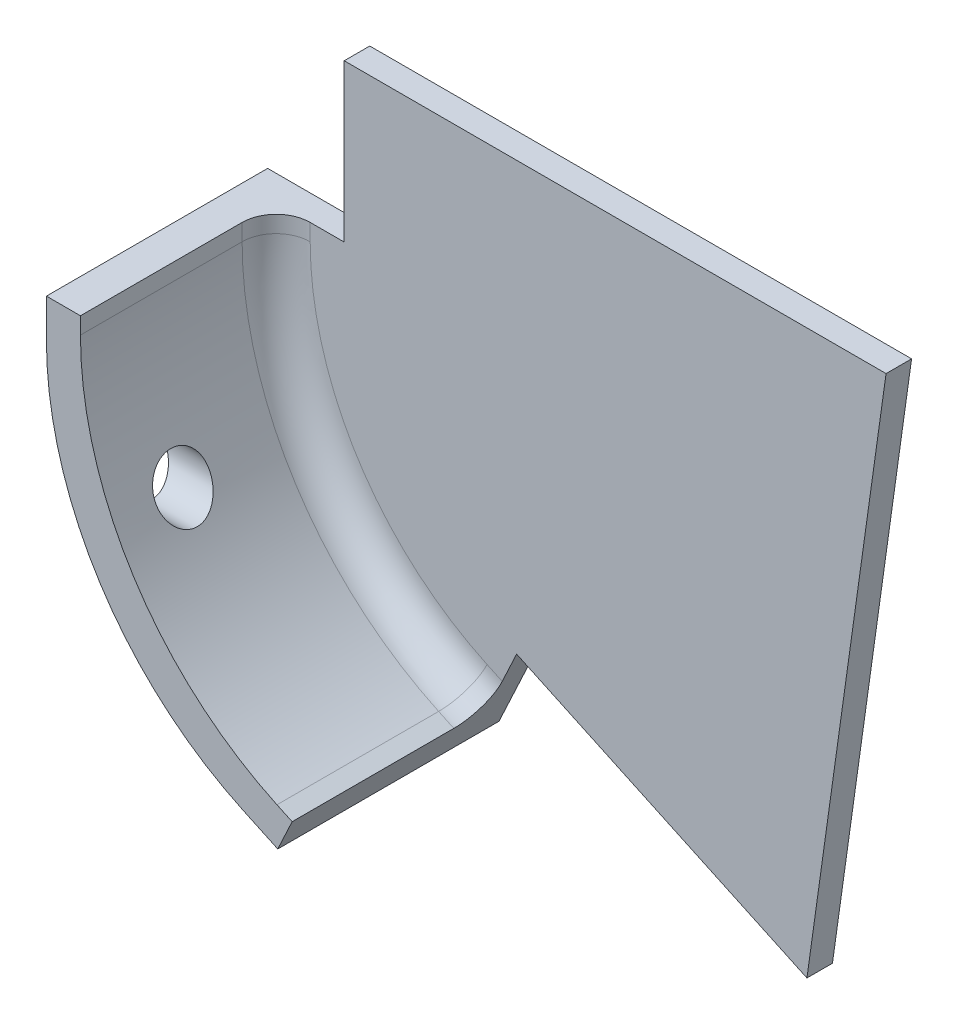
ISO-10303-21;
HEADER;
FILE_DESCRIPTION(('STEP AP214'),'2;1');
FILE_NAME('part.step','',(''),(''),'','','');
FILE_SCHEMA(('AUTOMOTIVE_DESIGN { 1 0 10303 214 1 1 1 1 }'));
ENDSEC;
DATA;
#1=APPLICATION_CONTEXT('core data for automotive mechanical design processes');
#2=APPLICATION_PROTOCOL_DEFINITION('international standard','automotive_design',2000,#1);
#3=PRODUCT_CONTEXT('',#1,'mechanical');
#4=PRODUCT('Part','Part','',(#3));
#5=PRODUCT_RELATED_PRODUCT_CATEGORY('part','',(#4));
#6=PRODUCT_DEFINITION_FORMATION('','',#4);
#7=PRODUCT_DEFINITION_CONTEXT('part definition',#1,'design');
#8=PRODUCT_DEFINITION('design','',#6,#7);
#9=PRODUCT_DEFINITION_SHAPE('','',#8);
#10=(LENGTH_UNIT() NAMED_UNIT(*) SI_UNIT(.MILLI.,.METRE.));
#11=(NAMED_UNIT(*) PLANE_ANGLE_UNIT() SI_UNIT($,.RADIAN.));
#12=(NAMED_UNIT(*) SI_UNIT($,.STERADIAN.) SOLID_ANGLE_UNIT());
#13=UNCERTAINTY_MEASURE_WITH_UNIT(LENGTH_MEASURE(1.E-05),#10,'distance_accuracy_value','');
#14=(GEOMETRIC_REPRESENTATION_CONTEXT(3) GLOBAL_UNCERTAINTY_ASSIGNED_CONTEXT((#13)) GLOBAL_UNIT_ASSIGNED_CONTEXT((#10,
#11,#12)) REPRESENTATION_CONTEXT('',''));
#15=CARTESIAN_POINT('',(0.,0.,0.));
#16=DIRECTION('',(0.,0.,1.));
#17=DIRECTION('',(1.,0.,0.));
#18=AXIS2_PLACEMENT_3D('',#15,#16,#17);
#19=CARTESIAN_POINT('',(-18.0763999587272,-9.66698227820091,1.5));
#20=DIRECTION('',(1.,0.,0.));
#21=DIRECTION('',(0.,1.,0.));
#22=AXIS2_PLACEMENT_3D('',#19,#20,#21);
#23=PLANE('',#22);
#24=DIRECTION('',(0.,-1.,0.));
#25=VECTOR('',#24,1.);
#26=CARTESIAN_POINT('',(-18.0763999587272,-9.66698227820091,0.));
#27=LINE('',#26,#25);
#28=CARTESIAN_POINT('',(-18.0763999587272,-4.26205433738103,0.));
#29=VERTEX_POINT('',#28);
#30=CARTESIAN_POINT('',(-18.0763999587272,-13.4894038430459,0.));
#31=VERTEX_POINT('',#30);
#32=EDGE_CURVE('E222',#29,#31,#27,.T.);
#33=ORIENTED_EDGE('',*,*,#32,.T.);
#34=DIRECTION('',(0.,0.,1.));
#35=VECTOR('',#34,1.);
#36=CARTESIAN_POINT('',(-18.0763999587272,-13.4894038430459,1.5));
#37=LINE('',#36,#35);
#38=CARTESIAN_POINT('',(-18.0763999587272,-13.4894038430459,1.5));
#39=VERTEX_POINT('',#38);
#40=EDGE_CURVE('E213',#31,#39,#37,.T.);
#41=ORIENTED_EDGE('',*,*,#40,.T.);
#42=DIRECTION('',(0.,-1.,0.));
#43=VECTOR('',#42,1.);
#44=CARTESIAN_POINT('',(-18.0763999587272,-4.26205433738103,1.5));
#45=LINE('',#44,#43);
#46=CARTESIAN_POINT('',(-18.0763999587272,-4.26205433738103,1.5));
#47=VERTEX_POINT('',#46);
#48=EDGE_CURVE('E223',#47,#39,#45,.T.);
#49=ORIENTED_EDGE('',*,*,#48,.F.);
#50=DIRECTION('',(0.,0.,-1.));
#51=VECTOR('',#50,1.);
#52=CARTESIAN_POINT('',(-18.0763999587272,-4.26205433738103,1.5));
#53=LINE('',#52,#51);
#54=EDGE_CURVE('E237',#47,#29,#53,.T.);
#55=ORIENTED_EDGE('',*,*,#54,.T.);
#56=EDGE_LOOP('',(#33,#41,#49,#55));
#57=FACE_BOUND('',#56,.T.);
#58=ADVANCED_FACE('F45',(#57),#23,.F.);
#59=CARTESIAN_POINT('',(-4.48178315317741,-31.0062562043114,1.5));
#60=DIRECTION('',(0.422618261740697,0.906307787036651,0.));
#61=DIRECTION('',(-0.906307787036651,0.422618261740697,0.));
#62=AXIS2_PLACEMENT_3D('',#59,#60,#61);
#63=PLANE('',#62);
#64=DIRECTION('',(0.906307787036651,-0.422618261740697,0.));
#65=VECTOR('',#64,1.);
#66=CARTESIAN_POINT('',(-4.48178315317741,-31.0062562043114,1.5));
#67=LINE('',#66,#65);
#68=CARTESIAN_POINT('',(-7.94607358273322,-29.3908310469364,1.5));
#69=VERTEX_POINT('',#68);
#70=CARTESIAN_POINT('',(9.11283365237236,-37.3455301304218,1.5));
#71=VERTEX_POINT('',#70);
#72=EDGE_CURVE('E227',#69,#71,#67,.T.);
#73=ORIENTED_EDGE('',*,*,#72,.F.);
#74=DIRECTION('',(0.,0.,-1.));
#75=VECTOR('',#74,1.);
#76=CARTESIAN_POINT('',(-7.94607358273322,-29.3908310469364,1.5));
#77=LINE('',#76,#75);
#78=CARTESIAN_POINT('',(-7.94607358273322,-29.3908310469364,0.));
#79=VERTEX_POINT('',#78);
#80=EDGE_CURVE('E219',#69,#79,#77,.T.);
#81=ORIENTED_EDGE('',*,*,#80,.T.);
#82=DIRECTION('',(0.906307787036651,-0.422618261740697,0.));
#83=VECTOR('',#82,1.);
#84=CARTESIAN_POINT('',(-4.48178315317741,-31.0062562043114,0.));
#85=LINE('',#84,#83);
#86=CARTESIAN_POINT('',(9.11283365237236,-37.3455301304218,0.));
#87=VERTEX_POINT('',#86);
#88=EDGE_CURVE('E240',#79,#87,#85,.T.);
#89=ORIENTED_EDGE('',*,*,#88,.T.);
#90=DIRECTION('',(0.,0.,-1.));
#91=VECTOR('',#90,1.);
#92=CARTESIAN_POINT('',(9.11283365237236,-37.3455301304218,1.5));
#93=LINE('',#92,#91);
#94=EDGE_CURVE('E256',#71,#87,#93,.T.);
#95=ORIENTED_EDGE('',*,*,#94,.F.);
#96=EDGE_LOOP('',(#73,#81,#89,#95));
#97=FACE_BOUND('',#96,.T.);
#98=ADVANCED_FACE('F377',(#97),#63,.F.);
#99=CARTESIAN_POINT('',(9.11283365237236,-37.3455301304218,1.5));
#100=DIRECTION('',(-0.990268068741571,0.139173100960062,0.));
#101=DIRECTION('',(-0.139173100960062,-0.990268068741571,0.));
#102=AXIS2_PLACEMENT_3D('',#99,#100,#101);
#103=PLANE('',#102);
#104=DIRECTION('',(0.139173100960062,0.990268068741571,0.));
#105=VECTOR('',#104,1.);
#106=CARTESIAN_POINT('',(9.11283365237236,-37.3455301304218,0.));
#107=LINE('',#106,#105);
#108=CARTESIAN_POINT('',(13.7624129551826,-4.26205433738103,0.));
#109=VERTEX_POINT('',#108);
#110=EDGE_CURVE('E243',#87,#109,#107,.T.);
#111=ORIENTED_EDGE('',*,*,#110,.T.);
#112=DIRECTION('',(0.,0.,-1.));
#113=VECTOR('',#112,1.);
#114=CARTESIAN_POINT('',(13.7624129551826,-4.26205433738103,1.5));
#115=LINE('',#114,#113);
#116=CARTESIAN_POINT('',(13.7624129551826,-4.26205433738103,1.5));
#117=VERTEX_POINT('',#116);
#118=EDGE_CURVE('E252',#117,#109,#115,.T.);
#119=ORIENTED_EDGE('',*,*,#118,.F.);
#120=DIRECTION('',(0.139173100960062,0.990268068741571,0.));
#121=VECTOR('',#120,1.);
#122=CARTESIAN_POINT('',(9.11283365237236,-37.3455301304218,1.5));
#123=LINE('',#122,#121);
#124=EDGE_CURVE('E231',#71,#117,#123,.T.);
#125=ORIENTED_EDGE('',*,*,#124,.F.);
#126=ORIENTED_EDGE('',*,*,#94,.T.);
#127=EDGE_LOOP('',(#111,#119,#125,#126));
#128=FACE_BOUND('',#127,.T.);
#129=ADVANCED_FACE('F373',(#128),#103,.F.);
#130=CARTESIAN_POINT('',(-18.0763999587272,-4.26205433738103,1.5));
#131=DIRECTION('',(0.,-1.,0.));
#132=DIRECTION('',(0.,0.,-1.));
#133=AXIS2_PLACEMENT_3D('',#130,#131,#132);
#134=PLANE('',#133);
#135=DIRECTION('',(-1.,0.,0.));
#136=VECTOR('',#135,1.);
#137=CARTESIAN_POINT('',(-18.0763999587272,-4.26205433738103,0.));
#138=LINE('',#137,#136);
#139=EDGE_CURVE('E228',#109,#29,#138,.T.);
#140=ORIENTED_EDGE('',*,*,#139,.T.);
#141=ORIENTED_EDGE('',*,*,#54,.F.);
#142=DIRECTION('',(-1.,0.,0.));
#143=VECTOR('',#142,1.);
#144=CARTESIAN_POINT('',(-18.0763999587272,-4.26205433738103,1.5));
#145=LINE('',#144,#143);
#146=EDGE_CURVE('E234',#117,#47,#145,.T.);
#147=ORIENTED_EDGE('',*,*,#146,.F.);
#148=ORIENTED_EDGE('',*,*,#118,.T.);
#149=EDGE_LOOP('',(#140,#141,#147,#148));
#150=FACE_BOUND('',#149,.T.);
#151=ADVANCED_FACE('F366',(#150),#134,.F.);
#152=CARTESIAN_POINT('',(0.,0.,1.5));
#153=DIRECTION('',(0.,0.,1.));
#154=DIRECTION('',(1.,0.,0.));
#155=AXIS2_PLACEMENT_3D('',#152,#153,#154);
#156=PLANE('',#155);
#157=DIRECTION('',(-1.,0.,0.));
#158=VECTOR('',#157,1.);
#159=CARTESIAN_POINT('',(-17.0763999587272,-13.4894038430459,1.5));
#160=LINE('',#159,#158);
#161=CARTESIAN_POINT('',(-20.0763999587272,-13.4894038430459,1.5));
#162=VERTEX_POINT('',#161);
#163=EDGE_CURVE('E174',#39,#162,#160,.T.);
#164=ORIENTED_EDGE('',*,*,#163,.T.);
#165=DIRECTION('',(0.,-1.,0.));
#166=VECTOR('',#165,1.);
#167=CARTESIAN_POINT('',(-20.0763999587272,0.,1.5));
#168=LINE('',#167,#166);
#169=CARTESIAN_POINT('',(-20.0763999587272,-14.473858105281,1.5));
#170=VERTEX_POINT('',#169);
#171=EDGE_CURVE('E288',#162,#170,#168,.T.);
#172=ORIENTED_EDGE('',*,*,#171,.T.);
#173=CARTESIAN_POINT('',(-2.07639995872717,-14.473858105281,1.5));
#174=DIRECTION('',(0.,0.,1.));
#175=DIRECTION('',(1.,0.,0.));
#176=AXIS2_PLACEMENT_3D('',#173,#174,#175);
#177=CIRCLE('',#176,18.);
#178=CARTESIAN_POINT('',(-9.68352867005972,-30.7873982719407,1.5));
#179=VERTEX_POINT('',#178);
#180=EDGE_CURVE('E282',#170,#179,#177,.T.);
#181=ORIENTED_EDGE('',*,*,#180,.T.);
#182=DIRECTION('',(0.906307787036651,-0.422618261740697,0.));
#183=VECTOR('',#182,1.);
#184=CARTESIAN_POINT('',(-13.5217958936059,-28.9975848715558,1.5));
#185=LINE('',#184,#183);
#186=CARTESIAN_POINT('',(-8.79131010621462,-31.2034466210097,1.5));
#187=VERTEX_POINT('',#186);
#188=EDGE_CURVE('E285',#179,#187,#185,.T.);
#189=ORIENTED_EDGE('',*,*,#188,.T.);
#190=DIRECTION('',(0.422618261740697,0.906307787036651,0.));
#191=VECTOR('',#190,1.);
#192=CARTESIAN_POINT('',(-9.63654662969602,-33.016062195083,1.5));
#193=LINE('',#192,#191);
#194=EDGE_CURVE('E319',#187,#69,#193,.T.);
#195=ORIENTED_EDGE('',*,*,#194,.T.);
#196=ORIENTED_EDGE('',*,*,#72,.T.);
#197=ORIENTED_EDGE('',*,*,#124,.T.);
#198=ORIENTED_EDGE('',*,*,#146,.T.);
#199=ORIENTED_EDGE('',*,*,#48,.T.);
#200=EDGE_LOOP('',(#164,#172,#181,#189,#195,#196,#197,#198,#199));
#201=FACE_BOUND('',#200,.T.);
#202=ADVANCED_FACE('F363',(#201),#156,.T.);
#203=CARTESIAN_POINT('',(0.,0.,0.));
#204=DIRECTION('',(0.,0.,1.));
#205=DIRECTION('',(1.,0.,0.));
#206=AXIS2_PLACEMENT_3D('',#203,#204,#205);
#207=PLANE('',#206);
#208=DIRECTION('',(-0.906307787036651,0.422618261740697,0.));
#209=VECTOR('',#208,1.);
#210=CARTESIAN_POINT('',(-10.4817831531774,-34.8286777691563,0.));
#211=LINE('',#210,#209);
#212=CARTESIAN_POINT('',(-10.4817831531774,-34.8286777691563,0.));
#213=VERTEX_POINT('',#212);
#214=CARTESIAN_POINT('',(-12.5287651935411,-33.874154367629,0.));
#215=VERTEX_POINT('',#214);
#216=EDGE_CURVE('E203',#213,#215,#211,.T.);
#217=ORIENTED_EDGE('',*,*,#216,.T.);
#218=CARTESIAN_POINT('',(-4.07639995872718,-15.747998626896,0.));
#219=DIRECTION('',(0.,0.,1.));
#220=DIRECTION('',(1.,0.,0.));
#221=AXIS2_PLACEMENT_3D('',#218,#219,#220);
#222=CIRCLE('',#221,20.);
#223=CARTESIAN_POINT('',(-24.0763999587272,-15.747998626896,0.));
#224=VERTEX_POINT('',#223);
#225=EDGE_CURVE('E270',#215,#224,#222,.F.);
#226=ORIENTED_EDGE('',*,*,#225,.T.);
#227=DIRECTION('',(0.,1.,0.));
#228=VECTOR('',#227,1.);
#229=CARTESIAN_POINT('',(-24.0763999587272,-28.4894038430459,0.));
#230=LINE('',#229,#228);
#231=CARTESIAN_POINT('',(-24.0763999587272,-13.4894038430459,0.));
#232=VERTEX_POINT('',#231);
#233=EDGE_CURVE('E190',#224,#232,#230,.T.);
#234=ORIENTED_EDGE('',*,*,#233,.T.);
#235=DIRECTION('',(1.,0.,0.));
#236=VECTOR('',#235,1.);
#237=CARTESIAN_POINT('',(-24.0763999587272,-13.4894038430459,0.));
#238=LINE('',#237,#236);
#239=EDGE_CURVE('E183',#232,#31,#238,.T.);
#240=ORIENTED_EDGE('',*,*,#239,.T.);
#241=ORIENTED_EDGE('',*,*,#32,.F.);
#242=ORIENTED_EDGE('',*,*,#139,.F.);
#243=ORIENTED_EDGE('',*,*,#110,.F.);
#244=ORIENTED_EDGE('',*,*,#88,.F.);
#245=DIRECTION('',(-0.422618261740697,-0.906307787036651,0.));
#246=VECTOR('',#245,1.);
#247=CARTESIAN_POINT('',(-10.4817831531774,-34.8286777691563,0.));
#248=LINE('',#247,#246);
#249=EDGE_CURVE('E164',#79,#213,#248,.T.);
#250=ORIENTED_EDGE('',*,*,#249,.T.);
#251=EDGE_LOOP('',(#217,#226,#234,#240,#241,#242,#243,#244,#250));
#252=FACE_BOUND('',#251,.T.);
#253=ADVANCED_FACE('F362',(#252),#207,.F.);
#254=CARTESIAN_POINT('',(-10.4817831531774,-34.8286777691563,13.));
#255=DIRECTION('',(0.906307787036651,-0.422618261740697,0.));
#256=DIRECTION('',(0.422618261740697,0.906307787036651,0.));
#257=AXIS2_PLACEMENT_3D('',#254,#255,#256);
#258=PLANE('',#257);
#259=ORIENTED_EDGE('',*,*,#194,.F.);
#260=CARTESIAN_POINT('',(-8.79131010621462,-31.2034466210097,3.5));
#261=DIRECTION('',(0.906307787036651,-0.422618261740697,0.));
#262=DIRECTION('',(0.422618261740697,0.906307787036651,0.));
#263=AXIS2_PLACEMENT_3D('',#260,#261,#262);
#264=CIRCLE('',#263,2.);
#265=CARTESIAN_POINT('',(-9.63654662969602,-33.016062195083,3.5));
#266=VERTEX_POINT('',#265);
#267=EDGE_CURVE('E11',#187,#266,#264,.F.);
#268=ORIENTED_EDGE('',*,*,#267,.T.);
#269=DIRECTION('',(0.,0.,1.));
#270=VECTOR('',#269,1.);
#271=CARTESIAN_POINT('',(-9.63654662969602,-33.016062195083,1.5));
#272=LINE('',#271,#270);
#273=CARTESIAN_POINT('',(-9.63654662969602,-33.016062195083,13.));
#274=VERTEX_POINT('',#273);
#275=EDGE_CURVE('E156',#266,#274,#272,.T.);
#276=ORIENTED_EDGE('',*,*,#275,.T.);
#277=DIRECTION('',(-0.422618261740697,-0.906307787036651,0.));
#278=VECTOR('',#277,1.);
#279=CARTESIAN_POINT('',(-10.4817831531774,-34.8286777691563,13.));
#280=LINE('',#279,#278);
#281=CARTESIAN_POINT('',(-10.4817831531774,-34.8286777691563,13.));
#282=VERTEX_POINT('',#281);
#283=EDGE_CURVE('E161',#274,#282,#280,.T.);
#284=ORIENTED_EDGE('',*,*,#283,.T.);
#285=DIRECTION('',(0.,0.,-1.));
#286=VECTOR('',#285,1.);
#287=CARTESIAN_POINT('',(-10.4817831531774,-34.8286777691563,13.));
#288=LINE('',#287,#286);
#289=EDGE_CURVE('E200',#282,#213,#288,.T.);
#290=ORIENTED_EDGE('',*,*,#289,.T.);
#291=ORIENTED_EDGE('',*,*,#249,.F.);
#292=ORIENTED_EDGE('',*,*,#80,.F.);
#293=EDGE_LOOP('',(#259,#268,#276,#284,#290,#291,#292));
#294=FACE_BOUND('',#293,.T.);
#295=ADVANCED_FACE('F158',(#294),#258,.T.);
#296=CARTESIAN_POINT('',(-24.0763999587272,-13.4894038430459,13.));
#297=DIRECTION('',(0.,1.,0.));
#298=DIRECTION('',(0.,0.,1.));
#299=AXIS2_PLACEMENT_3D('',#296,#297,#298);
#300=PLANE('',#299);
#301=DIRECTION('',(0.,0.,1.));
#302=VECTOR('',#301,1.);
#303=CARTESIAN_POINT('',(-22.0763999587272,-13.4894038430459,1.5));
#304=LINE('',#303,#302);
#305=CARTESIAN_POINT('',(-22.0763999587272,-13.4894038430459,3.5));
#306=VERTEX_POINT('',#305);
#307=CARTESIAN_POINT('',(-22.0763999587272,-13.4894038430459,13.));
#308=VERTEX_POINT('',#307);
#309=EDGE_CURVE('E165',#306,#308,#304,.T.);
#310=ORIENTED_EDGE('',*,*,#309,.F.);
#311=CARTESIAN_POINT('',(-20.0763999587272,-13.4894038430459,3.5));
#312=DIRECTION('',(0.,1.,0.));
#313=DIRECTION('',(0.,0.,1.));
#314=AXIS2_PLACEMENT_3D('',#311,#312,#313);
#315=CIRCLE('',#314,2.);
#316=EDGE_CURVE('E60',#306,#162,#315,.F.);
#317=ORIENTED_EDGE('',*,*,#316,.T.);
#318=ORIENTED_EDGE('',*,*,#163,.F.);
#319=ORIENTED_EDGE('',*,*,#40,.F.);
#320=ORIENTED_EDGE('',*,*,#239,.F.);
#321=DIRECTION('',(0.,0.,-1.));
#322=VECTOR('',#321,1.);
#323=CARTESIAN_POINT('',(-24.0763999587272,-13.4894038430459,13.));
#324=LINE('',#323,#322);
#325=CARTESIAN_POINT('',(-24.0763999587272,-13.4894038430459,13.));
#326=VERTEX_POINT('',#325);
#327=EDGE_CURVE('E209',#326,#232,#324,.T.);
#328=ORIENTED_EDGE('',*,*,#327,.F.);
#329=DIRECTION('',(1.,0.,0.));
#330=VECTOR('',#329,1.);
#331=CARTESIAN_POINT('',(-24.0763999587272,-13.4894038430459,13.));
#332=LINE('',#331,#330);
#333=EDGE_CURVE('E196',#326,#308,#332,.T.);
#334=ORIENTED_EDGE('',*,*,#333,.T.);
#335=EDGE_LOOP('',(#310,#317,#318,#319,#320,#328,#334));
#336=FACE_BOUND('',#335,.T.);
#337=ADVANCED_FACE('F349',(#336),#300,.T.);
#338=CARTESIAN_POINT('',(-24.0763999587272,-28.4894038430459,13.));
#339=DIRECTION('',(-1.,0.,0.));
#340=DIRECTION('',(0.,0.,1.));
#341=AXIS2_PLACEMENT_3D('',#338,#339,#340);
#342=PLANE('',#341);
#343=ORIENTED_EDGE('',*,*,#233,.F.);
#344=DIRECTION('',(0.,0.,-1.));
#345=VECTOR('',#344,1.);
#346=CARTESIAN_POINT('',(-24.0763999587272,-15.747998626896,13.));
#347=LINE('',#346,#345);
#348=CARTESIAN_POINT('',(-24.0763999587272,-15.747998626896,13.));
#349=VERTEX_POINT('',#348);
#350=EDGE_CURVE('E273',#224,#349,#347,.F.);
#351=ORIENTED_EDGE('',*,*,#350,.T.);
#352=DIRECTION('',(0.,1.,0.));
#353=VECTOR('',#352,1.);
#354=CARTESIAN_POINT('',(-24.0763999587272,-28.4894038430459,13.));
#355=LINE('',#354,#353);
#356=EDGE_CURVE('E187',#349,#326,#355,.T.);
#357=ORIENTED_EDGE('',*,*,#356,.T.);
#358=ORIENTED_EDGE('',*,*,#327,.T.);
#359=EDGE_LOOP('',(#343,#351,#357,#358));
#360=FACE_BOUND('',#359,.T.);
#361=ADVANCED_FACE('F352',(#360),#342,.T.);
#362=CARTESIAN_POINT('',(-10.4817831531774,-34.8286777691563,13.));
#363=DIRECTION('',(-0.422618261740697,-0.906307787036651,0.));
#364=DIRECTION('',(0.906307787036651,-0.422618261740697,0.));
#365=AXIS2_PLACEMENT_3D('',#362,#363,#364);
#366=PLANE('',#365);
#367=DIRECTION('',(-0.906307787036651,0.422618261740697,0.));
#368=VECTOR('',#367,1.);
#369=CARTESIAN_POINT('',(-10.4817831531774,-34.8286777691563,13.));
#370=LINE('',#369,#368);
#371=CARTESIAN_POINT('',(-12.5287651935411,-33.874154367629,13.));
#372=VERTEX_POINT('',#371);
#373=EDGE_CURVE('E181',#282,#372,#370,.T.);
#374=ORIENTED_EDGE('',*,*,#373,.T.);
#375=DIRECTION('',(0.,0.,-1.));
#376=VECTOR('',#375,1.);
#377=CARTESIAN_POINT('',(-12.5287651935411,-33.874154367629,13.));
#378=LINE('',#377,#376);
#379=EDGE_CURVE('E266',#372,#215,#378,.T.);
#380=ORIENTED_EDGE('',*,*,#379,.T.);
#381=ORIENTED_EDGE('',*,*,#216,.F.);
#382=ORIENTED_EDGE('',*,*,#289,.F.);
#383=EDGE_LOOP('',(#374,#380,#381,#382));
#384=FACE_BOUND('',#383,.T.);
#385=ADVANCED_FACE('F348',(#384),#366,.T.);
#386=CARTESIAN_POINT('',(0.,0.,13.));
#387=DIRECTION('',(0.,0.,1.));
#388=DIRECTION('',(1.,0.,0.));
#389=AXIS2_PLACEMENT_3D('',#386,#387,#388);
#390=PLANE('',#389);
#391=ORIENTED_EDGE('',*,*,#356,.F.);
#392=CARTESIAN_POINT('',(-4.07639995872718,-15.747998626896,13.));
#393=DIRECTION('',(0.,0.,1.));
#394=DIRECTION('',(1.,0.,0.));
#395=AXIS2_PLACEMENT_3D('',#392,#393,#394);
#396=CIRCLE('',#395,20.);
#397=EDGE_CURVE('E279',#349,#372,#396,.T.);
#398=ORIENTED_EDGE('',*,*,#397,.T.);
#399=ORIENTED_EDGE('',*,*,#373,.F.);
#400=ORIENTED_EDGE('',*,*,#283,.F.);
#401=DIRECTION('',(0.906307787036651,-0.422618261740697,0.));
#402=VECTOR('',#401,1.);
#403=CARTESIAN_POINT('',(-22.0763999587272,-27.2152633214309,13.));
#404=LINE('',#403,#402);
#405=CARTESIAN_POINT('',(-10.5287651935411,-32.600013846014,13.));
#406=VERTEX_POINT('',#405);
#407=EDGE_CURVE('E168',#406,#274,#404,.T.);
#408=ORIENTED_EDGE('',*,*,#407,.F.);
#409=CARTESIAN_POINT('',(-2.07639995872717,-14.473858105281,13.));
#410=DIRECTION('',(0.,0.,1.));
#411=DIRECTION('',(1.,0.,0.));
#412=AXIS2_PLACEMENT_3D('',#409,#410,#411);
#413=CIRCLE('',#412,20.);
#414=CARTESIAN_POINT('',(-22.0763999587272,-14.473858105281,13.));
#415=VERTEX_POINT('',#414);
#416=EDGE_CURVE('E276',#406,#415,#413,.F.);
#417=ORIENTED_EDGE('',*,*,#416,.T.);
#418=DIRECTION('',(0.,-1.,0.));
#419=VECTOR('',#418,1.);
#420=CARTESIAN_POINT('',(-22.0763999587272,-13.4894038430459,13.));
#421=LINE('',#420,#419);
#422=EDGE_CURVE('E175',#308,#415,#421,.T.);
#423=ORIENTED_EDGE('',*,*,#422,.F.);
#424=ORIENTED_EDGE('',*,*,#333,.F.);
#425=EDGE_LOOP('',(#391,#398,#399,#400,#408,#417,#423,#424));
#426=FACE_BOUND('',#425,.T.);
#427=ADVANCED_FACE('F179',(#426),#390,.T.);
#428=CARTESIAN_POINT('',(-22.0763999587272,-27.2152633214309,1.5));
#429=DIRECTION('',(-0.422618261740697,-0.906307787036651,0.));
#430=DIRECTION('',(0.906307787036651,-0.422618261740697,0.));
#431=AXIS2_PLACEMENT_3D('',#428,#429,#430);
#432=PLANE('',#431);
#433=ORIENTED_EDGE('',*,*,#275,.F.);
#434=DIRECTION('',(0.906307787036651,-0.422618261740697,0.));
#435=VECTOR('',#434,1.);
#436=CARTESIAN_POINT('',(-22.0763999587272,-27.2152633214309,3.5));
#437=LINE('',#436,#435);
#438=CARTESIAN_POINT('',(-10.5287651935411,-32.600013846014,3.5));
#439=VERTEX_POINT('',#438);
#440=EDGE_CURVE('E73',#266,#439,#437,.F.);
#441=ORIENTED_EDGE('',*,*,#440,.T.);
#442=DIRECTION('',(0.,0.,1.));
#443=VECTOR('',#442,1.);
#444=CARTESIAN_POINT('',(-10.5287651935411,-32.600013846014,13.));
#445=LINE('',#444,#443);
#446=EDGE_CURVE('E170',#439,#406,#445,.T.);
#447=ORIENTED_EDGE('',*,*,#446,.T.);
#448=ORIENTED_EDGE('',*,*,#407,.T.);
#449=EDGE_LOOP('',(#433,#441,#447,#448));
#450=FACE_BOUND('',#449,.T.);
#451=ADVANCED_FACE('F169',(#450),#432,.F.);
#452=CARTESIAN_POINT('',(-22.0763999587272,-13.4894038430459,1.5));
#453=DIRECTION('',(-1.,0.,0.));
#454=DIRECTION('',(0.,-1.,0.));
#455=AXIS2_PLACEMENT_3D('',#452,#453,#454);
#456=PLANE('',#455);
#457=DIRECTION('',(0.,0.,1.));
#458=VECTOR('',#457,1.);
#459=CARTESIAN_POINT('',(-22.0763999587272,-14.473858105281,1.5));
#460=LINE('',#459,#458);
#461=CARTESIAN_POINT('',(-22.0763999587272,-14.473858105281,3.5));
#462=VERTEX_POINT('',#461);
#463=EDGE_CURVE('E262',#415,#462,#460,.F.);
#464=ORIENTED_EDGE('',*,*,#463,.T.);
#465=DIRECTION('',(0.,-1.,0.));
#466=VECTOR('',#465,1.);
#467=CARTESIAN_POINT('',(-22.0763999587272,-13.4894038430459,3.5));
#468=LINE('',#467,#466);
#469=EDGE_CURVE('E292',#462,#306,#468,.F.);
#470=ORIENTED_EDGE('',*,*,#469,.T.);
#471=ORIENTED_EDGE('',*,*,#309,.T.);
#472=ORIENTED_EDGE('',*,*,#422,.T.);
#473=EDGE_LOOP('',(#464,#470,#471,#472));
#474=FACE_BOUND('',#473,.T.);
#475=ADVANCED_FACE('F343',(#474),#456,.F.);
#476=CARTESIAN_POINT('',(-2.07639995872717,-14.473858105281,1.5));
#477=DIRECTION('',(0.,0.,-1.));
#478=DIRECTION('',(-1.,0.,0.));
#479=AXIS2_PLACEMENT_3D('',#476,#477,#478);
#480=CYLINDRICAL_SURFACE('',#479,20.);
#481=CARTESIAN_POINT('',(-20.7678153372847,-21.5894038430459,9.));
#482=CARTESIAN_POINT('',(-20.7678141770929,-21.5894083477923,8.91474765280486));
#483=CARTESIAN_POINT('',(-20.7652141194363,-21.59624850969,8.82942455091662));
#484=CARTESIAN_POINT('',(-20.7548579455274,-21.623362191458,8.66118910248586));
#485=CARTESIAN_POINT('',(-20.7470949158574,-21.6436537231105,8.57828014415895));
#486=CARTESIAN_POINT('',(-20.7265847458111,-21.6968361999463,8.41741651534987));
#487=CARTESIAN_POINT('',(-20.7138457990636,-21.72970643053,8.33945394394204));
#488=CARTESIAN_POINT('',(-20.6836478983129,-21.806799491477,8.19040297434734));
#489=CARTESIAN_POINT('',(-20.666189888356,-21.8510200511236,8.11931320511746));
#490=CARTESIAN_POINT('',(-20.6264500346652,-21.950392178167,7.98410136696779));
#491=CARTESIAN_POINT('',(-20.604066421016,-22.0057718922472,7.92017730686733));
#492=CARTESIAN_POINT('',(-20.5551832526062,-22.12491755973,7.80255142947479));
#493=CARTESIAN_POINT('',(-20.5286826647529,-22.1886856174438,7.74885218549454));
#494=CARTESIAN_POINT('',(-20.4703421265083,-22.3268092162932,7.64959233177798));
#495=CARTESIAN_POINT('',(-20.438273641063,-22.4015752224839,7.60473816881799));
#496=CARTESIAN_POINT('',(-20.3707752476716,-22.5561194814951,7.52813122772998));
#497=CARTESIAN_POINT('',(-20.3353442092935,-22.6358994168454,7.49638287487449));
#498=CARTESIAN_POINT('',(-20.2588841184759,-22.8049167090655,7.44416973150596));
#499=CARTESIAN_POINT('',(-20.2176340311221,-22.8943982925161,7.4248194980617));
#500=CARTESIAN_POINT('',(-20.1330141468655,-23.0743572904798,7.40156154573441));
#501=CARTESIAN_POINT('',(-20.0896435513185,-23.1648350700927,7.39765969122245));
#502=CARTESIAN_POINT('',(-19.9983729495711,-23.3516109553059,7.40529416707784));
#503=CARTESIAN_POINT('',(-19.9503825357,-23.4478162291048,7.41805132041123));
#504=CARTESIAN_POINT('',(-19.8544415174331,-23.6364149454596,7.46067046275625));
#505=CARTESIAN_POINT('',(-19.8064909350409,-23.7288069283638,7.49053893772254));
#506=CARTESIAN_POINT('',(-19.7104182931736,-23.9106129399078,7.56822505753553));
#507=CARTESIAN_POINT('',(-19.6623530670658,-23.999797493663,7.61665429863555));
#508=CARTESIAN_POINT('',(-19.5698104265901,-24.1686952644619,7.73060610925776));
#509=CARTESIAN_POINT('',(-19.5253331011461,-24.2484082467814,7.79612910226799));
#510=CARTESIAN_POINT('',(-19.4442774994102,-24.3916848883631,7.93966837876934));
#511=CARTESIAN_POINT('',(-19.4074222198671,-24.4558408166981,8.0169323367066));
#512=CARTESIAN_POINT('',(-19.3413935255095,-24.5696165217967,8.18438878796248));
#513=CARTESIAN_POINT('',(-19.3122105588802,-24.6192543818979,8.27456498766338));
#514=CARTESIAN_POINT('',(-19.2670934534144,-24.6954903476004,8.45246251591766));
#515=CARTESIAN_POINT('',(-19.2499181312615,-24.7242662838447,8.53893348720007));
#516=CARTESIAN_POINT('',(-19.2244785219504,-24.7667699472041,8.71673221859721));
#517=CARTESIAN_POINT('',(-19.2162042384907,-24.7805145555239,8.80805440929903));
#518=CARTESIAN_POINT('',(-19.2097193110549,-24.7912895276127,8.98001620247026));
#519=CARTESIAN_POINT('',(-19.2103375295126,-24.7902649431104,9.06049672745231));
#520=CARTESIAN_POINT('',(-19.2187832857855,-24.7762248914562,9.22000732293299));
#521=CARTESIAN_POINT('',(-19.2266095178635,-24.7632115960684,9.29903765349093));
#522=CARTESIAN_POINT('',(-19.2485903824013,-24.7264826241785,9.45088963183583));
#523=CARTESIAN_POINT('',(-19.2625350561147,-24.703121796626,9.52382893480847));
#524=CARTESIAN_POINT('',(-19.2959116533199,-24.6468361738449,9.66455904451321));
#525=CARTESIAN_POINT('',(-19.3153447648437,-24.613909307899,9.73234873251921));
#526=CARTESIAN_POINT('',(-19.3604110863252,-24.5369136643781,9.86638900693852));
#527=CARTESIAN_POINT('',(-19.386399164388,-24.4921960202643,9.93214578597343));
#528=CARTESIAN_POINT('',(-19.4425109172062,-24.3946120423566,10.0552983310868));
#529=CARTESIAN_POINT('',(-19.4726365101564,-24.3417419275893,10.1126901935158));
#530=CARTESIAN_POINT('',(-19.5400666255967,-24.2219681296758,10.2253220381172));
#531=CARTESIAN_POINT('',(-19.5777955040344,-24.154133690797,10.2793181207414));
#532=CARTESIAN_POINT('',(-19.6558142267232,-24.0117193402881,10.3752004690934));
#533=CARTESIAN_POINT('',(-19.6961054013398,-23.9371359158881,10.4170803803427));
#534=CARTESIAN_POINT('',(-19.7830358504023,-23.7735681916658,10.4925856153317));
#535=CARTESIAN_POINT('',(-19.8298538364225,-23.6839328321647,10.524601647114));
#536=CARTESIAN_POINT('',(-19.9237938332917,-23.500549520692,10.5723142923477));
#537=CARTESIAN_POINT('',(-19.9709159587216,-23.4067999310227,10.5880043445843));
#538=CARTESIAN_POINT('',(-20.0667995153714,-23.2121603978326,10.6029758456432));
#539=CARTESIAN_POINT('',(-20.1155042765204,-23.1111652379061,10.6012857405919));
#540=CARTESIAN_POINT('',(-20.2103992174098,-22.9101146793263,10.5786787081918));
#541=CARTESIAN_POINT('',(-20.2565894966657,-22.8100592436115,10.5577625423388));
#542=CARTESIAN_POINT('',(-20.3439357146066,-22.6168356114382,10.4973756809901));
#543=CARTESIAN_POINT('',(-20.3851932155633,-22.5235548097872,10.4584158693228));
#544=CARTESIAN_POINT('',(-20.4628735725575,-22.344506538397,10.3625140341472));
#545=CARTESIAN_POINT('',(-20.4992990870436,-22.2587349461692,10.3055819573325));
#546=CARTESIAN_POINT('',(-20.563551822824,-22.1048231108972,10.1801445975852));
#547=CARTESIAN_POINT('',(-20.5918339627742,-22.0358210464537,10.112930870429));
#548=CARTESIAN_POINT('',(-20.6426486729994,-21.9101886262859,9.96588942851095));
#549=CARTESIAN_POINT('',(-20.6651828563363,-21.8535548002783,9.88606526284994));
#550=CARTESIAN_POINT('',(-20.70224349057,-21.7594809550254,9.72346012268883));
#551=CARTESIAN_POINT('',(-20.717285542508,-21.72082378857,9.64149836541554));
#552=CARTESIAN_POINT('',(-20.7416659202701,-21.6577987334115,9.47155557790439));
#553=CARTESIAN_POINT('',(-20.7510148250266,-21.6334043451857,9.38358605175157));
#554=CARTESIAN_POINT('',(-20.7608771051242,-21.6076085981892,9.2456798382603));
#555=CARTESIAN_POINT('',(-20.7634764590345,-21.600792619934,9.19683797429335));
#556=CARTESIAN_POINT('',(-20.7669458918636,-21.591688988438,9.09867196882994));
#557=CARTESIAN_POINT('',(-20.7678160088551,-21.5894012354989,9.04934783797562));
#558=CARTESIAN_POINT('',(-20.7678153372847,-21.5894038430459,9.));
#559=B_SPLINE_CURVE_WITH_KNOTS('',3,(#481,#482,#483,#484,#485,#486,#487,#488,#489,#490,#491,
#492,#493,#494,#495,#496,#497,#498,#499,#500,#501,#502,#503,#504,#505,#506,#507,#508,#509,#510,
#511,#512,#513,#514,#515,#516,#517,#518,#519,#520,#521,#522,#523,#524,#525,#526,#527,#528,#529,
#530,#531,#532,#533,#534,#535,#536,#537,#538,#539,#540,#541,#542,#543,#544,#545,#546,#547,#548,
#549,#550,#551,#552,#553,#554,#555,#556,#557,#558),.UNSPECIFIED.,.T.,.F.,(4,2,2,2,2,2,2,2,2,2,2,
2,2,2,2,2,2,2,2,2,2,2,2,2,2,2,2,2,2,2,2,2,2,2,2,2,2,2,4),(0.,0.255570349506439,0.51148360840357,
0.766977230467737,1.02241977894026,1.28374112914034,1.54512816023409,1.82264039760018,
2.10024626250512,2.40020774729306,2.70028308978061,3.0236316311414,3.34710281720143,
3.68230368441976,4.0175128568391,4.33660197015887,4.65529192484022,4.93186751804503,
5.20813217803132,5.44838813223272,5.68860057244064,5.92114605900592,6.15374192120056,
6.40372393387764,6.65382223449762,6.9363487371554,7.21902314688986,7.53585999843052,
7.85282413377038,8.18759876283927,8.522360132901,8.84817372634153,9.17380731447937,
9.47336921617181,9.77284695841974,10.0470297151429,10.3207014218929,10.4686401273802,
10.6165755756553),.UNSPECIFIED.);
#560=CARTESIAN_POINT('',(-20.7678153372847,-21.5894038430459,9.));
#561=VERTEX_POINT('',#560);
#562=EDGE_CURVE('E305',#561,#561,#559,.T.);
#563=ORIENTED_EDGE('',*,*,#562,.T.);
#564=EDGE_LOOP('',(#563));
#565=FACE_BOUND('',#564,.T.);
#566=ORIENTED_EDGE('',*,*,#446,.F.);
#567=CARTESIAN_POINT('',(-2.07639995872717,-14.473858105281,3.5));
#568=DIRECTION('',(0.,0.,1.));
#569=DIRECTION('',(1.,0.,0.));
#570=AXIS2_PLACEMENT_3D('',#567,#568,#569);
#571=CIRCLE('',#570,20.);
#572=EDGE_CURVE('E297',#439,#462,#571,.F.);
#573=ORIENTED_EDGE('',*,*,#572,.T.);
#574=ORIENTED_EDGE('',*,*,#463,.F.);
#575=ORIENTED_EDGE('',*,*,#416,.F.);
#576=EDGE_LOOP('',(#566,#573,#574,#575));
#577=FACE_BOUND('',#576,.T.);
#578=ADVANCED_FACE('F331',(#565,#577),#480,.F.);
#579=CARTESIAN_POINT('',(-4.07639995872718,-15.747998626896,13.));
#580=DIRECTION('',(0.,0.,-1.));
#581=DIRECTION('',(-1.,0.,0.));
#582=AXIS2_PLACEMENT_3D('',#579,#580,#581);
#583=CYLINDRICAL_SURFACE('',#582,20.);
#584=CARTESIAN_POINT('',(-23.2043372521401,-21.5894038430459,9.));
#585=CARTESIAN_POINT('',(-23.2043364933687,-21.5894081091698,8.91325204248347));
#586=CARTESIAN_POINT('',(-23.2021784156155,-21.5964875917499,8.82643857929268));
#587=CARTESIAN_POINT('',(-23.1935661572666,-21.6245761505456,8.65524373878808));
#588=CARTESIAN_POINT('',(-23.1871066833357,-21.6456023896352,8.57086549192249));
#589=CARTESIAN_POINT('',(-23.1699822975871,-21.7008082396105,8.40709336022188));
#590=CARTESIAN_POINT('',(-23.1593224331362,-21.7349720626378,8.32769362524216));
#591=CARTESIAN_POINT('',(-23.1339490187036,-21.8152539570409,8.17593551311524));
#592=CARTESIAN_POINT('',(-23.1192363241608,-21.861369505621,8.10357565440403));
#593=CARTESIAN_POINT('',(-23.0857238277731,-21.9647981391643,7.96664962612908));
#594=CARTESIAN_POINT('',(-23.0668655098093,-22.0222702104882,7.9022180660569));
#595=CARTESIAN_POINT('',(-23.02550810624,-22.1460886059721,7.78392891433833));
#596=CARTESIAN_POINT('',(-23.0030083453464,-22.2124365757285,7.7300732880562));
#597=CARTESIAN_POINT('',(-22.9537631823705,-22.3548933913646,7.63201833290732));
#598=CARTESIAN_POINT('',(-22.9268808455569,-22.4312921338398,7.58830947734903));
#599=CARTESIAN_POINT('',(-22.8701248111511,-22.5892670079657,7.51425011860846));
#600=CARTESIAN_POINT('',(-22.8402503676853,-22.6708444286944,7.48390295645872));
#601=CARTESIAN_POINT('',(-22.7763623002048,-22.8416701550543,7.43558412902913));
#602=CARTESIAN_POINT('',(-22.7422102186508,-22.9310915297882,7.41840773960472));
#603=CARTESIAN_POINT('',(-22.6720459487924,-23.1108288001018,7.39937496530009));
#604=CARTESIAN_POINT('',(-22.6360332166178,-23.201144950919,7.39752308557657));
#605=CARTESIAN_POINT('',(-22.560982503348,-23.3854488447606,7.40922621853556));
#606=CARTESIAN_POINT('',(-22.5218880276294,-23.4793590717137,7.42364956725673));
#607=CARTESIAN_POINT('',(-22.4437474509458,-23.6632077088405,7.4688318007352));
#608=CARTESIAN_POINT('',(-22.404701366153,-23.7531450246921,7.49959515626369));
#609=CARTESIAN_POINT('',(-22.3269241547002,-23.928942666425,7.57782594891659));
#610=CARTESIAN_POINT('',(-22.2882283732211,-24.0146333579879,7.62571176841619));
#611=CARTESIAN_POINT('',(-22.2137933984835,-24.1766946978617,7.73709845653644));
#612=CARTESIAN_POINT('',(-22.1780541241031,-24.2530656019199,7.80059889652699));
#613=CARTESIAN_POINT('',(-22.1124702762086,-24.3912515639449,7.93942784316193));
#614=CARTESIAN_POINT('',(-22.082462474745,-24.4534844069219,8.01426124089092));
#615=CARTESIAN_POINT('',(-22.028571116023,-24.5640832982669,8.17550518552437));
#616=CARTESIAN_POINT('',(-22.0046828616861,-24.6124599853609,8.26190677519029));
#617=CARTESIAN_POINT('',(-21.9666200399447,-24.6890100241393,8.43496832474842));
#618=CARTESIAN_POINT('',(-21.9517343754797,-24.7186743684318,8.52081134333351));
#619=CARTESIAN_POINT('',(-21.9293663995845,-24.7631094376449,8.6971789219026));
#620=CARTESIAN_POINT('',(-21.9218784122164,-24.7778915812413,8.78769983652011));
#621=CARTESIAN_POINT('',(-21.9151978696373,-24.7910805904597,8.96145030095132));
#622=CARTESIAN_POINT('',(-21.9152784718001,-24.7909222446471,9.04454633012122));
#623=CARTESIAN_POINT('',(-21.9219295767064,-24.7777897023403,9.20944344873399));
#624=CARTESIAN_POINT('',(-21.9284989531079,-24.7648177300761,9.29124476041421));
#625=CARTESIAN_POINT('',(-21.9474618682018,-24.7271728508154,9.44909067595317));
#626=CARTESIAN_POINT('',(-21.9596992963855,-24.7028134216764,9.52522971524493));
#627=CARTESIAN_POINT('',(-21.9892697050182,-24.643513770794,9.67219584845659));
#628=CARTESIAN_POINT('',(-22.0066036054407,-24.6085716387132,9.74302198043416));
#629=CARTESIAN_POINT('',(-22.04661981386,-24.5271420938312,9.88162801829837));
#630=CARTESIAN_POINT('',(-22.0695438827342,-24.4801253155533,9.94902602717476));
#631=CARTESIAN_POINT('',(-22.1191328615882,-24.3771962344524,10.075071063292));
#632=CARTESIAN_POINT('',(-22.1457991995581,-24.3212805348465,10.1337147323052));
#633=CARTESIAN_POINT('',(-22.2046178323137,-24.1962487938963,10.2466067412448));
#634=CARTESIAN_POINT('',(-22.2370514483412,-24.1263777638174,10.2998724532195));
#635=CARTESIAN_POINT('',(-22.3040372158358,-23.9796297876558,10.3939687876603));
#636=CARTESIAN_POINT('',(-22.3385902499928,-23.902749915977,10.4347941861902));
#637=CARTESIAN_POINT('',(-22.4117937067004,-23.7368806604919,10.5063589162543));
#638=CARTESIAN_POINT('',(-22.45053912963,-23.6474196135406,10.5359122869538));
#639=CARTESIAN_POINT('',(-22.5280257286486,-23.4646922826897,10.5789336061254));
#640=CARTESIAN_POINT('',(-22.5667669008101,-23.3714249844165,10.5923972373161));
#641=CARTESIAN_POINT('',(-22.6444653992876,-23.1802224051399,10.6029332418463));
#642=CARTESIAN_POINT('',(-22.6833833092922,-23.0822376444797,10.5994187451545));
#643=CARTESIAN_POINT('',(-22.758903337792,-22.887673366173,10.5743492850985));
#644=CARTESIAN_POINT('',(-22.7955056468635,-22.7910937333882,10.5527958084431));
#645=CARTESIAN_POINT('',(-22.8645107631929,-22.6048573686696,10.4925283466563));
#646=CARTESIAN_POINT('',(-22.8969961352334,-22.515087527919,10.4542603485175));
#647=CARTESIAN_POINT('',(-22.9579870211128,-22.342997101241,10.3613037854033));
#648=CARTESIAN_POINT('',(-22.9864940813133,-22.2606736253299,10.3066216267658));
#649=CARTESIAN_POINT('',(-23.0373069435537,-22.1111651721992,10.1857886548823));
#650=CARTESIAN_POINT('',(-23.0598782031822,-22.0433758590112,10.1204974059624));
#651=CARTESIAN_POINT('',(-23.1004319371253,-21.9197448265105,9.97818225445553));
#652=CARTESIAN_POINT('',(-23.1184148257055,-21.8639020286685,9.90115941207048));
#653=CARTESIAN_POINT('',(-23.1485597901238,-21.7692157368802,9.74237798675522));
#654=CARTESIAN_POINT('',(-23.1609952555605,-21.7295846321751,9.66113969463832));
#655=CARTESIAN_POINT('',(-23.1812750680443,-21.6644944067024,9.49272120181557));
#656=CARTESIAN_POINT('',(-23.189126553805,-21.6390132530032,9.40555047748654));
#657=CARTESIAN_POINT('',(-23.1978660612692,-21.61056153588,9.26474001753645));
#658=CARTESIAN_POINT('',(-23.2002910484168,-21.6026395529524,9.21214296518119));
#659=CARTESIAN_POINT('',(-23.2035268615456,-21.5920594472342,9.10637214650033));
#660=CARTESIAN_POINT('',(-23.2043377174584,-21.5894012268352,9.05319839088718));
#661=CARTESIAN_POINT('',(-23.2043372521401,-21.5894038430459,9.));
#662=B_SPLINE_CURVE_WITH_KNOTS('',3,(#584,#585,#586,#587,#588,#589,#590,#591,#592,#593,#594,
#595,#596,#597,#598,#599,#600,#601,#602,#603,#604,#605,#606,#607,#608,#609,#610,#611,#612,#613,
#614,#615,#616,#617,#618,#619,#620,#621,#622,#623,#624,#625,#626,#627,#628,#629,#630,#631,#632,
#633,#634,#635,#636,#637,#638,#639,#640,#641,#642,#643,#644,#645,#646,#647,#648,#649,#650,#651,
#652,#653,#654,#655,#656,#657,#658,#659,#660,#661),.UNSPECIFIED.,.T.,.F.,(4,2,2,2,2,2,2,2,2,2,2,
2,2,2,2,2,2,2,2,2,2,2,2,2,2,2,2,2,2,2,2,2,2,2,2,2,2,2,4),(0.,0.260045696821364,
0.520412000974049,0.780466387437901,1.04046592571311,1.30440255328552,1.56838818284303,
1.8432728106702,2.11822613320649,2.4087001308224,2.69925952003843,3.00608544462792,
3.3129953627964,3.62798400511456,3.94296400178263,4.2468551297948,4.55051230153518,
4.82509308507927,5.09946302991862,5.34751384566173,5.59552161152342,5.83707146634137,
6.07866495056445,6.33354842878096,6.58852943225299,6.86831630955714,7.14822051356679,
7.4524676803293,7.75679646593403,8.07171851467732,8.38661461121866,8.69357783093211,
9.00042140036579,9.28928865996565,9.57812982966246,9.85050477931575,10.1224544152795,
10.2819310134778,10.4414046544036),.UNSPECIFIED.);
#663=CARTESIAN_POINT('',(-23.2043372521401,-21.5894038430459,9.));
#664=VERTEX_POINT('',#663);
#665=EDGE_CURVE('E49',#664,#664,#662,.T.);
#666=ORIENTED_EDGE('',*,*,#665,.F.);
#667=EDGE_LOOP('',(#666));
#668=FACE_BOUND('',#667,.T.);
#669=ORIENTED_EDGE('',*,*,#397,.F.);
#670=ORIENTED_EDGE('',*,*,#350,.F.);
#671=ORIENTED_EDGE('',*,*,#225,.F.);
#672=ORIENTED_EDGE('',*,*,#379,.F.);
#673=EDGE_LOOP('',(#669,#670,#671,#672));
#674=FACE_BOUND('',#673,.T.);
#675=ADVANCED_FACE('F416',(#668,#674),#583,.T.);
#676=CARTESIAN_POINT('',(-13.5217958936059,-28.9975848715558,3.5));
#677=DIRECTION('',(0.906307787036651,-0.422618261740697,0.));
#678=DIRECTION('',(0.422618261740697,0.906307787036651,0.));
#679=AXIS2_PLACEMENT_3D('',#676,#677,#678);
#680=CYLINDRICAL_SURFACE('',#679,2.);
#681=ORIENTED_EDGE('',*,*,#267,.F.);
#682=ORIENTED_EDGE('',*,*,#188,.F.);
#683=CARTESIAN_POINT('',(-9.68352867005972,-30.7873982719407,3.5));
#684=DIRECTION('',(0.906307787036651,-0.422618261740697,0.));
#685=DIRECTION('',(0.422618261740697,0.906307787036651,0.));
#686=AXIS2_PLACEMENT_3D('',#683,#684,#685);
#687=CIRCLE('',#686,2.);
#688=EDGE_CURVE('E304',#439,#179,#687,.T.);
#689=ORIENTED_EDGE('',*,*,#688,.F.);
#690=ORIENTED_EDGE('',*,*,#440,.F.);
#691=EDGE_LOOP('',(#681,#682,#689,#690));
#692=FACE_BOUND('',#691,.T.);
#693=ADVANCED_FACE('F47',(#692),#680,.F.);
#694=CARTESIAN_POINT('',(-2.07639995872717,-14.473858105281,3.5));
#695=DIRECTION('',(0.,0.,1.));
#696=DIRECTION('',(1.,0.,0.));
#697=AXIS2_PLACEMENT_3D('',#694,#695,#696);
#698=TOROIDAL_SURFACE('',#697,18.,2.);
#699=ORIENTED_EDGE('',*,*,#688,.T.);
#700=ORIENTED_EDGE('',*,*,#180,.F.);
#701=CARTESIAN_POINT('',(-20.0763999587272,-14.473858105281,3.5));
#702=DIRECTION('',(0.,-1.,0.));
#703=DIRECTION('',(0.,0.,-1.));
#704=AXIS2_PLACEMENT_3D('',#701,#702,#703);
#705=CIRCLE('',#704,2.);
#706=EDGE_CURVE('E302',#462,#170,#705,.T.);
#707=ORIENTED_EDGE('',*,*,#706,.F.);
#708=ORIENTED_EDGE('',*,*,#572,.F.);
#709=EDGE_LOOP('',(#699,#700,#707,#708));
#710=FACE_BOUND('',#709,.T.);
#711=ADVANCED_FACE('F402',(#710),#698,.F.);
#712=CARTESIAN_POINT('',(-20.0763999587272,0.,3.5));
#713=DIRECTION('',(0.,-1.,0.));
#714=DIRECTION('',(1.,0.,0.));
#715=AXIS2_PLACEMENT_3D('',#712,#713,#714);
#716=CYLINDRICAL_SURFACE('',#715,2.);
#717=ORIENTED_EDGE('',*,*,#316,.F.);
#718=ORIENTED_EDGE('',*,*,#469,.F.);
#719=ORIENTED_EDGE('',*,*,#706,.T.);
#720=ORIENTED_EDGE('',*,*,#171,.F.);
#721=EDGE_LOOP('',(#717,#718,#719,#720));
#722=FACE_BOUND('',#721,.T.);
#723=ADVANCED_FACE('F338',(#722),#716,.F.);
#724=CARTESIAN_POINT('',(-27.8263999587272,-23.1894038430459,9.));
#725=DIRECTION('',(1.,0.,0.));
#726=DIRECTION('',(0.,1.,0.));
#727=AXIS2_PLACEMENT_3D('',#724,#725,#726);
#728=CYLINDRICAL_SURFACE('',#727,1.6);
#729=ORIENTED_EDGE('',*,*,#665,.T.);
#730=EDGE_LOOP('',(#729));
#731=FACE_BOUND('',#730,.T.);
#732=ORIENTED_EDGE('',*,*,#562,.F.);
#733=EDGE_LOOP('',(#732));
#734=FACE_BOUND('',#733,.T.);
#735=ADVANCED_FACE('F334',(#731,#734),#728,.F.);
#736=CLOSED_SHELL('',(#58,#98,#129,#151,#202,#253,#295,#337,#361,#385,#427,#451,#475,#578,#675,
#693,#711,#723,#735));
#737=MANIFOLD_SOLID_BREP('B2',#736);
#738=ADVANCED_BREP_SHAPE_REPRESENTATION('',(#18,#737),#14);
#739=SHAPE_DEFINITION_REPRESENTATION(#9,#738);
ENDSEC;
END-ISO-10303-21;
